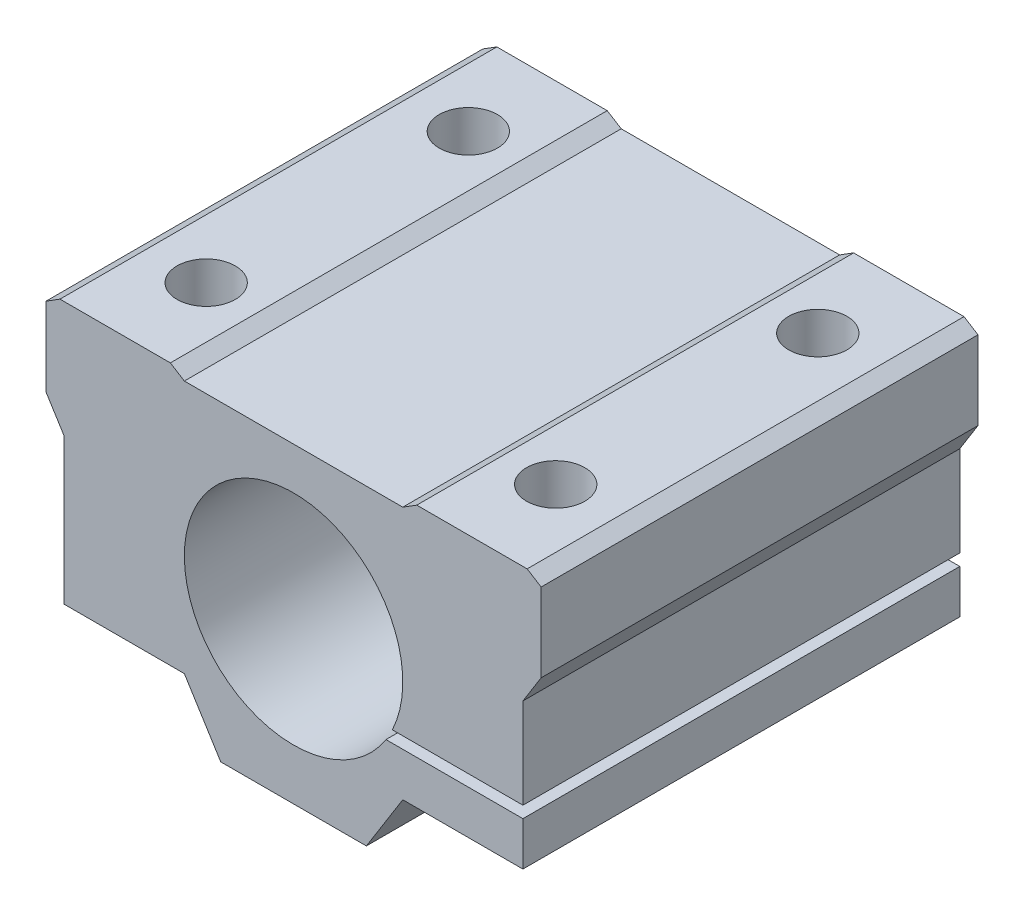
ISO-10303-21;
HEADER;
FILE_DESCRIPTION(('STEP AP214'),'2;1');
FILE_NAME('part.step','',(''),(''),'','','');
FILE_SCHEMA(('AUTOMOTIVE_DESIGN { 1 0 10303 214 1 1 1 1 }'));
ENDSEC;
DATA;
#1=APPLICATION_CONTEXT('core data for automotive mechanical design processes');
#2=APPLICATION_PROTOCOL_DEFINITION('international standard','automotive_design',2000,#1);
#3=PRODUCT_CONTEXT('',#1,'mechanical');
#4=PRODUCT('Part','Part','',(#3));
#5=PRODUCT_RELATED_PRODUCT_CATEGORY('part','',(#4));
#6=PRODUCT_DEFINITION_FORMATION('','',#4);
#7=PRODUCT_DEFINITION_CONTEXT('part definition',#1,'design');
#8=PRODUCT_DEFINITION('design','',#6,#7);
#9=PRODUCT_DEFINITION_SHAPE('','',#8);
#10=(LENGTH_UNIT() NAMED_UNIT(*) SI_UNIT(.MILLI.,.METRE.));
#11=(NAMED_UNIT(*) PLANE_ANGLE_UNIT() SI_UNIT($,.RADIAN.));
#12=(NAMED_UNIT(*) SI_UNIT($,.STERADIAN.) SOLID_ANGLE_UNIT());
#13=UNCERTAINTY_MEASURE_WITH_UNIT(LENGTH_MEASURE(1.E-05),#10,'distance_accuracy_value','');
#14=(GEOMETRIC_REPRESENTATION_CONTEXT(3) GLOBAL_UNCERTAINTY_ASSIGNED_CONTEXT((#13)) GLOBAL_UNIT_ASSIGNED_CONTEXT((#10,
#11,#12)) REPRESENTATION_CONTEXT('',''));
#15=CARTESIAN_POINT('',(0.,0.,0.));
#16=DIRECTION('',(0.,0.,1.));
#17=DIRECTION('',(1.,0.,0.));
#18=AXIS2_PLACEMENT_3D('',#15,#16,#17);
#19=CARTESIAN_POINT('',(-12.,-11.,24.));
#20=DIRECTION('',(0.,1.,0.));
#21=DIRECTION('',(-1.,0.,0.));
#22=AXIS2_PLACEMENT_3D('',#19,#20,#21);
#23=CYLINDRICAL_SURFACE('',#22,1.7);
#24=CARTESIAN_POINT('',(-12.,-7.,24.));
#25=DIRECTION('',(0.,1.,0.));
#26=DIRECTION('',(-1.,0.,0.));
#27=AXIS2_PLACEMENT_3D('',#24,#25,#26);
#28=CIRCLE('',#27,1.7);
#29=CARTESIAN_POINT('',(-13.7,-7.00000000000001,24.));
#30=VERTEX_POINT('',#29);
#31=EDGE_CURVE('E346',#30,#30,#28,.T.);
#32=ORIENTED_EDGE('',*,*,#31,.F.);
#33=EDGE_LOOP('',(#32));
#34=FACE_BOUND('',#33,.T.);
#35=CARTESIAN_POINT('',(-12.,3.,24.));
#36=DIRECTION('',(0.,1.,0.));
#37=DIRECTION('',(-1.,0.,0.));
#38=AXIS2_PLACEMENT_3D('',#35,#36,#37);
#39=CIRCLE('',#38,1.7);
#40=CARTESIAN_POINT('',(-13.7,3.,24.));
#41=VERTEX_POINT('',#40);
#42=EDGE_CURVE('E362',#41,#41,#39,.F.);
#43=ORIENTED_EDGE('',*,*,#42,.F.);
#44=EDGE_LOOP('',(#43));
#45=FACE_BOUND('',#44,.T.);
#46=ADVANCED_FACE('F33',(#34,#45),#23,.F.);
#47=CARTESIAN_POINT('',(12.,-11.,6.));
#48=DIRECTION('',(0.,1.,0.));
#49=DIRECTION('',(-1.,0.,0.));
#50=AXIS2_PLACEMENT_3D('',#47,#48,#49);
#51=CYLINDRICAL_SURFACE('',#50,1.7);
#52=CARTESIAN_POINT('',(12.,-3.2,6.));
#53=DIRECTION('',(0.,1.,0.));
#54=DIRECTION('',(-1.,0.,0.));
#55=AXIS2_PLACEMENT_3D('',#52,#53,#54);
#56=CIRCLE('',#55,1.7);
#57=CARTESIAN_POINT('',(10.3,-3.2,6.));
#58=VERTEX_POINT('',#57);
#59=EDGE_CURVE('E342',#58,#58,#56,.T.);
#60=ORIENTED_EDGE('',*,*,#59,.F.);
#61=EDGE_LOOP('',(#60));
#62=FACE_BOUND('',#61,.T.);
#63=CARTESIAN_POINT('',(12.,3.,6.));
#64=DIRECTION('',(0.,1.,0.));
#65=DIRECTION('',(-1.,0.,0.));
#66=AXIS2_PLACEMENT_3D('',#63,#64,#65);
#67=CIRCLE('',#66,1.7);
#68=CARTESIAN_POINT('',(10.3,3.,6.));
#69=VERTEX_POINT('',#68);
#70=EDGE_CURVE('E354',#69,#69,#67,.F.);
#71=ORIENTED_EDGE('',*,*,#70,.F.);
#72=EDGE_LOOP('',(#71));
#73=FACE_BOUND('',#72,.T.);
#74=ADVANCED_FACE('F513',(#62,#73),#51,.F.);
#75=CARTESIAN_POINT('',(15.75,-7.,30.));
#76=DIRECTION('',(-1.,0.,0.));
#77=DIRECTION('',(0.,0.,1.));
#78=AXIS2_PLACEMENT_3D('',#75,#76,#77);
#79=PLANE('',#78);
#80=DIRECTION('',(0.,1.,0.));
#81=VECTOR('',#80,1.);
#82=CARTESIAN_POINT('',(15.75,-7.,0.));
#83=LINE('',#82,#81);
#84=CARTESIAN_POINT('',(15.75,-7.,0.));
#85=VERTEX_POINT('',#84);
#86=CARTESIAN_POINT('',(15.75,-4.,0.));
#87=VERTEX_POINT('',#86);
#88=EDGE_CURVE('E250',#85,#87,#83,.T.);
#89=ORIENTED_EDGE('',*,*,#88,.T.);
#90=DIRECTION('',(0.,0.,1.));
#91=VECTOR('',#90,1.);
#92=CARTESIAN_POINT('',(15.75,-4.,30.));
#93=LINE('',#92,#91);
#94=CARTESIAN_POINT('',(15.75,-4.,30.));
#95=VERTEX_POINT('',#94);
#96=EDGE_CURVE('E188',#87,#95,#93,.T.);
#97=ORIENTED_EDGE('',*,*,#96,.T.);
#98=DIRECTION('',(0.,1.,0.));
#99=VECTOR('',#98,1.);
#100=CARTESIAN_POINT('',(15.75,-7.,30.));
#101=LINE('',#100,#99);
#102=CARTESIAN_POINT('',(15.75,-7.,30.));
#103=VERTEX_POINT('',#102);
#104=EDGE_CURVE('E205',#103,#95,#101,.T.);
#105=ORIENTED_EDGE('',*,*,#104,.F.);
#106=DIRECTION('',(0.,0.,-1.));
#107=VECTOR('',#106,1.);
#108=CARTESIAN_POINT('',(15.75,-7.,30.));
#109=LINE('',#108,#107);
#110=EDGE_CURVE('E328',#103,#85,#109,.T.);
#111=ORIENTED_EDGE('',*,*,#110,.T.);
#112=EDGE_LOOP('',(#89,#97,#105,#111));
#113=FACE_BOUND('',#112,.T.);
#114=ADVANCED_FACE('F424',(#113),#79,.F.);
#115=CARTESIAN_POINT('',(0.,0.,30.));
#116=DIRECTION('',(0.,0.,1.));
#117=DIRECTION('',(1.,0.,0.));
#118=AXIS2_PLACEMENT_3D('',#115,#116,#117);
#119=PLANE('',#118);
#120=DIRECTION('',(1.,0.,0.));
#121=VECTOR('',#120,1.);
#122=CARTESIAN_POINT('',(17.,-4.,30.));
#123=LINE('',#122,#121);
#124=CARTESIAN_POINT('',(6.34428877022476,-4.,30.));
#125=VERTEX_POINT('',#124);
#126=EDGE_CURVE('E198',#125,#95,#123,.T.);
#127=ORIENTED_EDGE('',*,*,#126,.F.);
#128=CARTESIAN_POINT('',(0.,0.,30.));
#129=DIRECTION('',(0.,0.,1.));
#130=DIRECTION('',(1.,0.,0.));
#131=AXIS2_PLACEMENT_3D('',#128,#129,#130);
#132=CIRCLE('',#131,7.5);
#133=CARTESIAN_POINT('',(6.78306715284465,-3.2,30.));
#134=VERTEX_POINT('',#133);
#135=EDGE_CURVE('E197',#134,#125,#132,.T.);
#136=ORIENTED_EDGE('',*,*,#135,.F.);
#137=DIRECTION('',(-1.,0.,0.));
#138=VECTOR('',#137,1.);
#139=CARTESIAN_POINT('',(17.,-3.2,30.));
#140=LINE('',#139,#138);
#141=CARTESIAN_POINT('',(15.75,-3.2,30.));
#142=VERTEX_POINT('',#141);
#143=EDGE_CURVE('E57',#142,#134,#140,.T.);
#144=ORIENTED_EDGE('',*,*,#143,.F.);
#145=CARTESIAN_POINT('',(15.75,3.,30.));
#146=VERTEX_POINT('',#145);
#147=EDGE_CURVE('E194',#142,#146,#101,.T.);
#148=ORIENTED_EDGE('',*,*,#147,.T.);
#149=DIRECTION('',(0.529998940003179,0.847998304005088,0.));
#150=VECTOR('',#149,1.);
#151=CARTESIAN_POINT('',(15.75,3.,30.));
#152=LINE('',#151,#150);
#153=CARTESIAN_POINT('',(17.,5.,30.));
#154=VERTEX_POINT('',#153);
#155=EDGE_CURVE('E209',#146,#154,#152,.T.);
#156=ORIENTED_EDGE('',*,*,#155,.T.);
#157=DIRECTION('',(0.,1.,0.));
#158=VECTOR('',#157,1.);
#159=CARTESIAN_POINT('',(17.,5.,30.));
#160=LINE('',#159,#158);
#161=CARTESIAN_POINT('',(17.,10.4,30.));
#162=VERTEX_POINT('',#161);
#163=EDGE_CURVE('E215',#154,#162,#160,.T.);
#164=ORIENTED_EDGE('',*,*,#163,.T.);
#165=DIRECTION('',(-0.847998304005089,0.529998940003177,0.));
#166=VECTOR('',#165,1.);
#167=CARTESIAN_POINT('',(17.,10.4,30.));
#168=LINE('',#167,#166);
#169=CARTESIAN_POINT('',(16.04,11.,30.));
#170=VERTEX_POINT('',#169);
#171=EDGE_CURVE('E217',#162,#170,#168,.T.);
#172=ORIENTED_EDGE('',*,*,#171,.T.);
#173=DIRECTION('',(-1.,0.,0.));
#174=VECTOR('',#173,1.);
#175=CARTESIAN_POINT('',(16.04,11.,30.));
#176=LINE('',#175,#174);
#177=CARTESIAN_POINT('',(8.46000000000001,11.,30.));
#178=VERTEX_POINT('',#177);
#179=EDGE_CURVE('E219',#170,#178,#176,.T.);
#180=ORIENTED_EDGE('',*,*,#179,.T.);
#181=DIRECTION('',(-0.847998304005089,-0.529998940003177,0.));
#182=VECTOR('',#181,1.);
#183=CARTESIAN_POINT('',(8.46000000000001,11.,30.));
#184=LINE('',#183,#182);
#185=CARTESIAN_POINT('',(7.5,10.4,30.));
#186=VERTEX_POINT('',#185);
#187=EDGE_CURVE('E221',#178,#186,#184,.T.);
#188=ORIENTED_EDGE('',*,*,#187,.T.);
#189=DIRECTION('',(-1.,0.,0.));
#190=VECTOR('',#189,1.);
#191=CARTESIAN_POINT('',(7.5,10.4,30.));
#192=LINE('',#191,#190);
#193=CARTESIAN_POINT('',(-7.5,10.4,30.));
#194=VERTEX_POINT('',#193);
#195=EDGE_CURVE('E223',#186,#194,#192,.T.);
#196=ORIENTED_EDGE('',*,*,#195,.T.);
#197=DIRECTION('',(-0.847998304005089,0.529998940003177,0.));
#198=VECTOR('',#197,1.);
#199=CARTESIAN_POINT('',(-8.46000000000001,11.,30.));
#200=LINE('',#199,#198);
#201=CARTESIAN_POINT('',(-8.46000000000001,11.,30.));
#202=VERTEX_POINT('',#201);
#203=EDGE_CURVE('E225',#194,#202,#200,.T.);
#204=ORIENTED_EDGE('',*,*,#203,.T.);
#205=DIRECTION('',(-1.,0.,0.));
#206=VECTOR('',#205,1.);
#207=CARTESIAN_POINT('',(-16.04,11.,30.));
#208=LINE('',#207,#206);
#209=CARTESIAN_POINT('',(-16.04,11.,30.));
#210=VERTEX_POINT('',#209);
#211=EDGE_CURVE('E227',#202,#210,#208,.T.);
#212=ORIENTED_EDGE('',*,*,#211,.T.);
#213=DIRECTION('',(-0.847998304005089,-0.529998940003177,0.));
#214=VECTOR('',#213,1.);
#215=CARTESIAN_POINT('',(-17.,10.4,30.));
#216=LINE('',#215,#214);
#217=CARTESIAN_POINT('',(-17.,10.4,30.));
#218=VERTEX_POINT('',#217);
#219=EDGE_CURVE('E229',#210,#218,#216,.T.);
#220=ORIENTED_EDGE('',*,*,#219,.T.);
#221=DIRECTION('',(0.,-1.,0.));
#222=VECTOR('',#221,1.);
#223=CARTESIAN_POINT('',(-17.,5.,30.));
#224=LINE('',#223,#222);
#225=CARTESIAN_POINT('',(-17.,5.,30.));
#226=VERTEX_POINT('',#225);
#227=EDGE_CURVE('E231',#218,#226,#224,.T.);
#228=ORIENTED_EDGE('',*,*,#227,.T.);
#229=DIRECTION('',(0.529998940003179,-0.847998304005088,0.));
#230=VECTOR('',#229,1.);
#231=CARTESIAN_POINT('',(-15.75,3.,30.));
#232=LINE('',#231,#230);
#233=CARTESIAN_POINT('',(-15.75,3.,30.));
#234=VERTEX_POINT('',#233);
#235=EDGE_CURVE('E233',#226,#234,#232,.T.);
#236=ORIENTED_EDGE('',*,*,#235,.T.);
#237=DIRECTION('',(0.,-1.,0.));
#238=VECTOR('',#237,1.);
#239=CARTESIAN_POINT('',(-15.75,-7.00000000000001,30.));
#240=LINE('',#239,#238);
#241=CARTESIAN_POINT('',(-15.75,-7.00000000000001,30.));
#242=VERTEX_POINT('',#241);
#243=EDGE_CURVE('E235',#234,#242,#240,.T.);
#244=ORIENTED_EDGE('',*,*,#243,.T.);
#245=DIRECTION('',(1.,0.,0.));
#246=VECTOR('',#245,1.);
#247=CARTESIAN_POINT('',(-7.5,-7.,30.));
#248=LINE('',#247,#246);
#249=CARTESIAN_POINT('',(-7.5,-7.,30.));
#250=VERTEX_POINT('',#249);
#251=EDGE_CURVE('E237',#242,#250,#248,.T.);
#252=ORIENTED_EDGE('',*,*,#251,.T.);
#253=DIRECTION('',(0.529998940003179,-0.847998304005088,0.));
#254=VECTOR('',#253,1.);
#255=CARTESIAN_POINT('',(-5.,-11.,30.));
#256=LINE('',#255,#254);
#257=CARTESIAN_POINT('',(-5.,-11.,30.));
#258=VERTEX_POINT('',#257);
#259=EDGE_CURVE('E239',#250,#258,#256,.T.);
#260=ORIENTED_EDGE('',*,*,#259,.T.);
#261=DIRECTION('',(1.,0.,0.));
#262=VECTOR('',#261,1.);
#263=CARTESIAN_POINT('',(-5.,-11.,30.));
#264=LINE('',#263,#262);
#265=CARTESIAN_POINT('',(5.00000000000001,-11.,30.));
#266=VERTEX_POINT('',#265);
#267=EDGE_CURVE('E241',#258,#266,#264,.T.);
#268=ORIENTED_EDGE('',*,*,#267,.T.);
#269=DIRECTION('',(0.529998940003179,0.847998304005089,0.));
#270=VECTOR('',#269,1.);
#271=CARTESIAN_POINT('',(5.00000000000001,-11.,30.));
#272=LINE('',#271,#270);
#273=CARTESIAN_POINT('',(7.5,-7.,30.));
#274=VERTEX_POINT('',#273);
#275=EDGE_CURVE('E210',#266,#274,#272,.T.);
#276=ORIENTED_EDGE('',*,*,#275,.T.);
#277=DIRECTION('',(1.,0.,0.));
#278=VECTOR('',#277,1.);
#279=CARTESIAN_POINT('',(7.5,-7.,30.));
#280=LINE('',#279,#278);
#281=EDGE_CURVE('E206',#274,#103,#280,.T.);
#282=ORIENTED_EDGE('',*,*,#281,.T.);
#283=ORIENTED_EDGE('',*,*,#104,.T.);
#284=EDGE_LOOP('',(#127,#136,#144,#148,#156,#164,#172,#180,#188,#196,#204,#212,#220,#228,#236,
#244,#252,#260,#268,#276,#282,#283));
#285=FACE_BOUND('',#284,.T.);
#286=ADVANCED_FACE('F193',(#285),#119,.T.);
#287=CARTESIAN_POINT('',(0.,0.,0.));
#288=DIRECTION('',(0.,0.,1.));
#289=DIRECTION('',(1.,0.,0.));
#290=AXIS2_PLACEMENT_3D('',#287,#288,#289);
#291=PLANE('',#290);
#292=CARTESIAN_POINT('',(0.,0.,0.));
#293=DIRECTION('',(0.,0.,1.));
#294=DIRECTION('',(1.,0.,0.));
#295=AXIS2_PLACEMENT_3D('',#292,#293,#294);
#296=CIRCLE('',#295,7.5);
#297=CARTESIAN_POINT('',(6.78306715284465,-3.2,0.));
#298=VERTEX_POINT('',#297);
#299=CARTESIAN_POINT('',(6.34428877022476,-4.,0.));
#300=VERTEX_POINT('',#299);
#301=EDGE_CURVE('E408',#298,#300,#296,.T.);
#302=ORIENTED_EDGE('',*,*,#301,.T.);
#303=DIRECTION('',(1.,0.,0.));
#304=VECTOR('',#303,1.);
#305=CARTESIAN_POINT('',(17.,-4.,0.));
#306=LINE('',#305,#304);
#307=EDGE_CURVE('E49',#300,#87,#306,.T.);
#308=ORIENTED_EDGE('',*,*,#307,.T.);
#309=ORIENTED_EDGE('',*,*,#88,.F.);
#310=DIRECTION('',(1.,0.,0.));
#311=VECTOR('',#310,1.);
#312=CARTESIAN_POINT('',(7.5,-7.,0.));
#313=LINE('',#312,#311);
#314=CARTESIAN_POINT('',(7.5,-7.,0.));
#315=VERTEX_POINT('',#314);
#316=EDGE_CURVE('E247',#315,#85,#313,.T.);
#317=ORIENTED_EDGE('',*,*,#316,.F.);
#318=DIRECTION('',(0.529998940003179,0.847998304005089,0.));
#319=VECTOR('',#318,1.);
#320=CARTESIAN_POINT('',(5.00000000000001,-11.,0.));
#321=LINE('',#320,#319);
#322=CARTESIAN_POINT('',(5.00000000000001,-11.,0.));
#323=VERTEX_POINT('',#322);
#324=EDGE_CURVE('E244',#323,#315,#321,.T.);
#325=ORIENTED_EDGE('',*,*,#324,.F.);
#326=DIRECTION('',(1.,0.,0.));
#327=VECTOR('',#326,1.);
#328=CARTESIAN_POINT('',(-5.,-11.,0.));
#329=LINE('',#328,#327);
#330=CARTESIAN_POINT('',(-5.,-11.,0.));
#331=VERTEX_POINT('',#330);
#332=EDGE_CURVE('E281',#331,#323,#329,.T.);
#333=ORIENTED_EDGE('',*,*,#332,.F.);
#334=DIRECTION('',(0.529998940003179,-0.847998304005088,0.));
#335=VECTOR('',#334,1.);
#336=CARTESIAN_POINT('',(-5.,-11.,0.));
#337=LINE('',#336,#335);
#338=CARTESIAN_POINT('',(-7.5,-7.,0.));
#339=VERTEX_POINT('',#338);
#340=EDGE_CURVE('E279',#339,#331,#337,.T.);
#341=ORIENTED_EDGE('',*,*,#340,.F.);
#342=DIRECTION('',(1.,0.,0.));
#343=VECTOR('',#342,1.);
#344=CARTESIAN_POINT('',(-7.5,-7.,0.));
#345=LINE('',#344,#343);
#346=CARTESIAN_POINT('',(-15.75,-7.00000000000001,0.));
#347=VERTEX_POINT('',#346);
#348=EDGE_CURVE('E277',#347,#339,#345,.T.);
#349=ORIENTED_EDGE('',*,*,#348,.F.);
#350=DIRECTION('',(0.,-1.,0.));
#351=VECTOR('',#350,1.);
#352=CARTESIAN_POINT('',(-15.75,-7.00000000000001,0.));
#353=LINE('',#352,#351);
#354=CARTESIAN_POINT('',(-15.75,3.,0.));
#355=VERTEX_POINT('',#354);
#356=EDGE_CURVE('E275',#355,#347,#353,.T.);
#357=ORIENTED_EDGE('',*,*,#356,.F.);
#358=DIRECTION('',(0.529998940003179,-0.847998304005088,0.));
#359=VECTOR('',#358,1.);
#360=CARTESIAN_POINT('',(-15.75,3.,0.));
#361=LINE('',#360,#359);
#362=CARTESIAN_POINT('',(-17.,5.,0.));
#363=VERTEX_POINT('',#362);
#364=EDGE_CURVE('E273',#363,#355,#361,.T.);
#365=ORIENTED_EDGE('',*,*,#364,.F.);
#366=DIRECTION('',(0.,-1.,0.));
#367=VECTOR('',#366,1.);
#368=CARTESIAN_POINT('',(-17.,5.,0.));
#369=LINE('',#368,#367);
#370=CARTESIAN_POINT('',(-17.,10.4,0.));
#371=VERTEX_POINT('',#370);
#372=EDGE_CURVE('E271',#371,#363,#369,.T.);
#373=ORIENTED_EDGE('',*,*,#372,.F.);
#374=DIRECTION('',(-0.847998304005089,-0.529998940003177,0.));
#375=VECTOR('',#374,1.);
#376=CARTESIAN_POINT('',(-17.,10.4,0.));
#377=LINE('',#376,#375);
#378=CARTESIAN_POINT('',(-16.04,11.,0.));
#379=VERTEX_POINT('',#378);
#380=EDGE_CURVE('E269',#379,#371,#377,.T.);
#381=ORIENTED_EDGE('',*,*,#380,.F.);
#382=DIRECTION('',(-1.,0.,0.));
#383=VECTOR('',#382,1.);
#384=CARTESIAN_POINT('',(-16.04,11.,0.));
#385=LINE('',#384,#383);
#386=CARTESIAN_POINT('',(-8.46000000000001,11.,0.));
#387=VERTEX_POINT('',#386);
#388=EDGE_CURVE('E267',#387,#379,#385,.T.);
#389=ORIENTED_EDGE('',*,*,#388,.F.);
#390=DIRECTION('',(-0.847998304005089,0.529998940003177,0.));
#391=VECTOR('',#390,1.);
#392=CARTESIAN_POINT('',(-8.46000000000001,11.,0.));
#393=LINE('',#392,#391);
#394=CARTESIAN_POINT('',(-7.5,10.4,0.));
#395=VERTEX_POINT('',#394);
#396=EDGE_CURVE('E265',#395,#387,#393,.T.);
#397=ORIENTED_EDGE('',*,*,#396,.F.);
#398=DIRECTION('',(-1.,0.,0.));
#399=VECTOR('',#398,1.);
#400=CARTESIAN_POINT('',(7.5,10.4,0.));
#401=LINE('',#400,#399);
#402=CARTESIAN_POINT('',(7.5,10.4,0.));
#403=VERTEX_POINT('',#402);
#404=EDGE_CURVE('E263',#403,#395,#401,.T.);
#405=ORIENTED_EDGE('',*,*,#404,.F.);
#406=DIRECTION('',(-0.847998304005089,-0.529998940003177,0.));
#407=VECTOR('',#406,1.);
#408=CARTESIAN_POINT('',(8.46000000000001,11.,0.));
#409=LINE('',#408,#407);
#410=CARTESIAN_POINT('',(8.46000000000001,11.,0.));
#411=VERTEX_POINT('',#410);
#412=EDGE_CURVE('E261',#411,#403,#409,.T.);
#413=ORIENTED_EDGE('',*,*,#412,.F.);
#414=DIRECTION('',(-1.,0.,0.));
#415=VECTOR('',#414,1.);
#416=CARTESIAN_POINT('',(16.04,11.,0.));
#417=LINE('',#416,#415);
#418=CARTESIAN_POINT('',(16.04,11.,0.));
#419=VERTEX_POINT('',#418);
#420=EDGE_CURVE('E259',#419,#411,#417,.T.);
#421=ORIENTED_EDGE('',*,*,#420,.F.);
#422=DIRECTION('',(-0.847998304005089,0.529998940003177,0.));
#423=VECTOR('',#422,1.);
#424=CARTESIAN_POINT('',(17.,10.4,0.));
#425=LINE('',#424,#423);
#426=CARTESIAN_POINT('',(17.,10.4,0.));
#427=VERTEX_POINT('',#426);
#428=EDGE_CURVE('E257',#427,#419,#425,.T.);
#429=ORIENTED_EDGE('',*,*,#428,.F.);
#430=DIRECTION('',(0.,1.,0.));
#431=VECTOR('',#430,1.);
#432=CARTESIAN_POINT('',(17.,5.,0.));
#433=LINE('',#432,#431);
#434=CARTESIAN_POINT('',(17.,5.,0.));
#435=VERTEX_POINT('',#434);
#436=EDGE_CURVE('E255',#435,#427,#433,.T.);
#437=ORIENTED_EDGE('',*,*,#436,.F.);
#438=DIRECTION('',(0.529998940003179,0.847998304005088,0.));
#439=VECTOR('',#438,1.);
#440=CARTESIAN_POINT('',(15.75,3.,0.));
#441=LINE('',#440,#439);
#442=CARTESIAN_POINT('',(15.75,3.,0.));
#443=VERTEX_POINT('',#442);
#444=EDGE_CURVE('E253',#443,#435,#441,.T.);
#445=ORIENTED_EDGE('',*,*,#444,.F.);
#446=CARTESIAN_POINT('',(15.75,-3.2,0.));
#447=VERTEX_POINT('',#446);
#448=EDGE_CURVE('E249',#447,#443,#83,.T.);
#449=ORIENTED_EDGE('',*,*,#448,.F.);
#450=DIRECTION('',(-1.,0.,0.));
#451=VECTOR('',#450,1.);
#452=CARTESIAN_POINT('',(17.,-3.2,0.));
#453=LINE('',#452,#451);
#454=EDGE_CURVE('E184',#447,#298,#453,.T.);
#455=ORIENTED_EDGE('',*,*,#454,.T.);
#456=EDGE_LOOP('',(#302,#308,#309,#317,#325,#333,#341,#349,#357,#365,#373,#381,#389,#397,#405,
#413,#421,#429,#437,#445,#449,#455));
#457=FACE_BOUND('',#456,.T.);
#458=ADVANCED_FACE('F429',(#457),#291,.F.);
#459=CARTESIAN_POINT('',(5.00000000000001,-11.,30.));
#460=DIRECTION('',(-0.847998304005088,0.529998940003179,0.));
#461=DIRECTION('',(-0.529998940003179,-0.847998304005089,0.));
#462=AXIS2_PLACEMENT_3D('',#459,#460,#461);
#463=PLANE('',#462);
#464=ORIENTED_EDGE('',*,*,#324,.T.);
#465=DIRECTION('',(0.,0.,-1.));
#466=VECTOR('',#465,1.);
#467=CARTESIAN_POINT('',(7.5,-7.,30.));
#468=LINE('',#467,#466);
#469=EDGE_CURVE('E331',#274,#315,#468,.T.);
#470=ORIENTED_EDGE('',*,*,#469,.F.);
#471=ORIENTED_EDGE('',*,*,#275,.F.);
#472=DIRECTION('',(0.,0.,-1.));
#473=VECTOR('',#472,1.);
#474=CARTESIAN_POINT('',(5.00000000000001,-11.,30.));
#475=LINE('',#474,#473);
#476=EDGE_CURVE('E243',#266,#323,#475,.T.);
#477=ORIENTED_EDGE('',*,*,#476,.T.);
#478=EDGE_LOOP('',(#464,#470,#471,#477));
#479=FACE_BOUND('',#478,.T.);
#480=ADVANCED_FACE('F35',(#479),#463,.F.);
#481=CARTESIAN_POINT('',(7.5,-7.,30.));
#482=DIRECTION('',(0.,1.,0.));
#483=DIRECTION('',(-1.,0.,0.));
#484=AXIS2_PLACEMENT_3D('',#481,#482,#483);
#485=PLANE('',#484);
#486=CARTESIAN_POINT('',(12.,-7.,24.));
#487=DIRECTION('',(0.,1.,0.));
#488=DIRECTION('',(-1.,0.,0.));
#489=AXIS2_PLACEMENT_3D('',#486,#487,#488);
#490=CIRCLE('',#489,1.7);
#491=CARTESIAN_POINT('',(10.3,-7.,24.));
#492=VERTEX_POINT('',#491);
#493=EDGE_CURVE('E349',#492,#492,#490,.T.);
#494=ORIENTED_EDGE('',*,*,#493,.T.);
#495=EDGE_LOOP('',(#494));
#496=FACE_BOUND('',#495,.T.);
#497=CARTESIAN_POINT('',(12.,-7.,6.));
#498=DIRECTION('',(0.,1.,0.));
#499=DIRECTION('',(-1.,0.,0.));
#500=AXIS2_PLACEMENT_3D('',#497,#498,#499);
#501=CIRCLE('',#500,1.7);
#502=CARTESIAN_POINT('',(10.3,-7.,6.));
#503=VERTEX_POINT('',#502);
#504=EDGE_CURVE('E393',#503,#503,#501,.T.);
#505=ORIENTED_EDGE('',*,*,#504,.T.);
#506=EDGE_LOOP('',(#505));
#507=FACE_BOUND('',#506,.T.);
#508=CARTESIAN_POINT('',(11.625,-7.,15.));
#509=DIRECTION('',(0.,-1.,0.));
#510=DIRECTION('',(1.,0.,0.));
#511=AXIS2_PLACEMENT_3D('',#508,#509,#510);
#512=CIRCLE('',#511,1.05);
#513=CARTESIAN_POINT('',(12.675,-7.,15.));
#514=VERTEX_POINT('',#513);
#515=EDGE_CURVE('E396',#514,#514,#512,.T.);
#516=ORIENTED_EDGE('',*,*,#515,.F.);
#517=EDGE_LOOP('',(#516));
#518=FACE_BOUND('',#517,.T.);
#519=ORIENTED_EDGE('',*,*,#316,.T.);
#520=ORIENTED_EDGE('',*,*,#110,.F.);
#521=ORIENTED_EDGE('',*,*,#281,.F.);
#522=ORIENTED_EDGE('',*,*,#469,.T.);
#523=EDGE_LOOP('',(#519,#520,#521,#522));
#524=FACE_BOUND('',#523,.T.);
#525=ADVANCED_FACE('F420',(#496,#507,#518,#524),#485,.F.);
#526=ORIENTED_EDGE('',*,*,#147,.F.);
#527=DIRECTION('',(0.,0.,-1.));
#528=VECTOR('',#527,1.);
#529=CARTESIAN_POINT('',(15.75,-3.2,30.));
#530=LINE('',#529,#528);
#531=EDGE_CURVE('E181',#142,#447,#530,.T.);
#532=ORIENTED_EDGE('',*,*,#531,.T.);
#533=ORIENTED_EDGE('',*,*,#448,.T.);
#534=DIRECTION('',(0.,0.,-1.));
#535=VECTOR('',#534,1.);
#536=CARTESIAN_POINT('',(15.75,3.,30.));
#537=LINE('',#536,#535);
#538=EDGE_CURVE('E203',#146,#443,#537,.T.);
#539=ORIENTED_EDGE('',*,*,#538,.F.);
#540=EDGE_LOOP('',(#526,#532,#533,#539));
#541=FACE_BOUND('',#540,.T.);
#542=ADVANCED_FACE('F201',(#541),#79,.F.);
#543=CARTESIAN_POINT('',(15.75,3.,30.));
#544=DIRECTION('',(-0.847998304005088,0.529998940003179,0.));
#545=DIRECTION('',(-0.529998940003179,-0.847998304005089,0.));
#546=AXIS2_PLACEMENT_3D('',#543,#544,#545);
#547=PLANE('',#546);
#548=ORIENTED_EDGE('',*,*,#444,.T.);
#549=DIRECTION('',(0.,0.,-1.));
#550=VECTOR('',#549,1.);
#551=CARTESIAN_POINT('',(17.,5.,30.));
#552=LINE('',#551,#550);
#553=EDGE_CURVE('E324',#154,#435,#552,.T.);
#554=ORIENTED_EDGE('',*,*,#553,.F.);
#555=ORIENTED_EDGE('',*,*,#155,.F.);
#556=ORIENTED_EDGE('',*,*,#538,.T.);
#557=EDGE_LOOP('',(#548,#554,#555,#556));
#558=FACE_BOUND('',#557,.T.);
#559=ADVANCED_FACE('F433',(#558),#547,.F.);
#560=CARTESIAN_POINT('',(17.,5.,30.));
#561=DIRECTION('',(-1.,0.,0.));
#562=DIRECTION('',(0.,0.,1.));
#563=AXIS2_PLACEMENT_3D('',#560,#561,#562);
#564=PLANE('',#563);
#565=ORIENTED_EDGE('',*,*,#436,.T.);
#566=DIRECTION('',(0.,0.,-1.));
#567=VECTOR('',#566,1.);
#568=CARTESIAN_POINT('',(17.,10.4,30.));
#569=LINE('',#568,#567);
#570=EDGE_CURVE('E321',#162,#427,#569,.T.);
#571=ORIENTED_EDGE('',*,*,#570,.F.);
#572=ORIENTED_EDGE('',*,*,#163,.F.);
#573=ORIENTED_EDGE('',*,*,#553,.T.);
#574=EDGE_LOOP('',(#565,#571,#572,#573));
#575=FACE_BOUND('',#574,.T.);
#576=ADVANCED_FACE('F440',(#575),#564,.F.);
#577=CARTESIAN_POINT('',(17.,10.4,30.));
#578=DIRECTION('',(-0.529998940003177,-0.847998304005089,0.));
#579=DIRECTION('',(0.84799830400509,-0.529998940003178,0.));
#580=AXIS2_PLACEMENT_3D('',#577,#578,#579);
#581=PLANE('',#580);
#582=ORIENTED_EDGE('',*,*,#428,.T.);
#583=DIRECTION('',(0.,0.,-1.));
#584=VECTOR('',#583,1.);
#585=CARTESIAN_POINT('',(16.04,11.,30.));
#586=LINE('',#585,#584);
#587=EDGE_CURVE('E318',#170,#419,#586,.T.);
#588=ORIENTED_EDGE('',*,*,#587,.F.);
#589=ORIENTED_EDGE('',*,*,#171,.F.);
#590=ORIENTED_EDGE('',*,*,#570,.T.);
#591=EDGE_LOOP('',(#582,#588,#589,#590));
#592=FACE_BOUND('',#591,.T.);
#593=ADVANCED_FACE('F443',(#592),#581,.F.);
#594=CARTESIAN_POINT('',(16.04,11.,30.));
#595=DIRECTION('',(0.,-1.,0.));
#596=DIRECTION('',(0.,0.,-1.));
#597=AXIS2_PLACEMENT_3D('',#594,#595,#596);
#598=PLANE('',#597);
#599=CARTESIAN_POINT('',(12.,11.,24.));
#600=DIRECTION('',(0.,1.,0.));
#601=DIRECTION('',(1.,0.,0.));
#602=AXIS2_PLACEMENT_3D('',#599,#600,#601);
#603=CIRCLE('',#602,2.);
#604=CARTESIAN_POINT('',(14.,11.,24.));
#605=VERTEX_POINT('',#604);
#606=EDGE_CURVE('E378',#605,#605,#603,.T.);
#607=ORIENTED_EDGE('',*,*,#606,.F.);
#608=EDGE_LOOP('',(#607));
#609=FACE_BOUND('',#608,.T.);
#610=CARTESIAN_POINT('',(12.,11.,6.));
#611=DIRECTION('',(0.,1.,0.));
#612=DIRECTION('',(-1.,0.,0.));
#613=AXIS2_PLACEMENT_3D('',#610,#611,#612);
#614=CIRCLE('',#613,2.);
#615=CARTESIAN_POINT('',(10.,11.,6.));
#616=VERTEX_POINT('',#615);
#617=EDGE_CURVE('E360',#616,#616,#614,.T.);
#618=ORIENTED_EDGE('',*,*,#617,.F.);
#619=EDGE_LOOP('',(#618));
#620=FACE_BOUND('',#619,.T.);
#621=ORIENTED_EDGE('',*,*,#420,.T.);
#622=DIRECTION('',(0.,0.,-1.));
#623=VECTOR('',#622,1.);
#624=CARTESIAN_POINT('',(8.46000000000001,11.,30.));
#625=LINE('',#624,#623);
#626=EDGE_CURVE('E315',#178,#411,#625,.T.);
#627=ORIENTED_EDGE('',*,*,#626,.F.);
#628=ORIENTED_EDGE('',*,*,#179,.F.);
#629=ORIENTED_EDGE('',*,*,#587,.T.);
#630=EDGE_LOOP('',(#621,#627,#628,#629));
#631=FACE_BOUND('',#630,.T.);
#632=ADVANCED_FACE('F448',(#609,#620,#631),#598,.F.);
#633=CARTESIAN_POINT('',(8.46000000000001,11.,30.));
#634=DIRECTION('',(0.529998940003177,-0.847998304005089,0.));
#635=DIRECTION('',(0.84799830400509,0.529998940003178,0.));
#636=AXIS2_PLACEMENT_3D('',#633,#634,#635);
#637=PLANE('',#636);
#638=ORIENTED_EDGE('',*,*,#412,.T.);
#639=DIRECTION('',(0.,0.,-1.));
#640=VECTOR('',#639,1.);
#641=CARTESIAN_POINT('',(7.5,10.4,30.));
#642=LINE('',#641,#640);
#643=EDGE_CURVE('E312',#186,#403,#642,.T.);
#644=ORIENTED_EDGE('',*,*,#643,.F.);
#645=ORIENTED_EDGE('',*,*,#187,.F.);
#646=ORIENTED_EDGE('',*,*,#626,.T.);
#647=EDGE_LOOP('',(#638,#644,#645,#646));
#648=FACE_BOUND('',#647,.T.);
#649=ADVANCED_FACE('F454',(#648),#637,.F.);
#650=CARTESIAN_POINT('',(7.5,10.4,30.));
#651=DIRECTION('',(0.,-1.,0.));
#652=DIRECTION('',(1.,0.,0.));
#653=AXIS2_PLACEMENT_3D('',#650,#651,#652);
#654=PLANE('',#653);
#655=ORIENTED_EDGE('',*,*,#404,.T.);
#656=DIRECTION('',(0.,0.,-1.));
#657=VECTOR('',#656,1.);
#658=CARTESIAN_POINT('',(-7.5,10.4,30.));
#659=LINE('',#658,#657);
#660=EDGE_CURVE('E309',#194,#395,#659,.T.);
#661=ORIENTED_EDGE('',*,*,#660,.F.);
#662=ORIENTED_EDGE('',*,*,#195,.F.);
#663=ORIENTED_EDGE('',*,*,#643,.T.);
#664=EDGE_LOOP('',(#655,#661,#662,#663));
#665=FACE_BOUND('',#664,.T.);
#666=ADVANCED_FACE('F458',(#665),#654,.F.);
#667=CARTESIAN_POINT('',(-8.46000000000001,11.,30.));
#668=DIRECTION('',(-0.529998940003177,-0.847998304005089,0.));
#669=DIRECTION('',(0.84799830400509,-0.529998940003178,0.));
#670=AXIS2_PLACEMENT_3D('',#667,#668,#669);
#671=PLANE('',#670);
#672=ORIENTED_EDGE('',*,*,#396,.T.);
#673=DIRECTION('',(0.,0.,-1.));
#674=VECTOR('',#673,1.);
#675=CARTESIAN_POINT('',(-8.46000000000001,11.,30.));
#676=LINE('',#675,#674);
#677=EDGE_CURVE('E306',#202,#387,#676,.T.);
#678=ORIENTED_EDGE('',*,*,#677,.F.);
#679=ORIENTED_EDGE('',*,*,#203,.F.);
#680=ORIENTED_EDGE('',*,*,#660,.T.);
#681=EDGE_LOOP('',(#672,#678,#679,#680));
#682=FACE_BOUND('',#681,.T.);
#683=ADVANCED_FACE('F463',(#682),#671,.F.);
#684=CARTESIAN_POINT('',(-16.04,11.,30.));
#685=DIRECTION('',(0.,-1.,0.));
#686=DIRECTION('',(1.,0.,0.));
#687=AXIS2_PLACEMENT_3D('',#684,#685,#686);
#688=PLANE('',#687);
#689=CARTESIAN_POINT('',(-12.,11.,24.));
#690=DIRECTION('',(0.,1.,0.));
#691=DIRECTION('',(-1.,0.,0.));
#692=AXIS2_PLACEMENT_3D('',#689,#690,#691);
#693=CIRCLE('',#692,2.);
#694=CARTESIAN_POINT('',(-14.,11.,24.));
#695=VERTEX_POINT('',#694);
#696=EDGE_CURVE('E371',#695,#695,#693,.T.);
#697=ORIENTED_EDGE('',*,*,#696,.F.);
#698=EDGE_LOOP('',(#697));
#699=FACE_BOUND('',#698,.T.);
#700=CARTESIAN_POINT('',(-12.,11.,6.));
#701=DIRECTION('',(0.,1.,0.));
#702=DIRECTION('',(1.,0.,0.));
#703=AXIS2_PLACEMENT_3D('',#700,#701,#702);
#704=CIRCLE('',#703,2.);
#705=CARTESIAN_POINT('',(-10.,11.,6.));
#706=VERTEX_POINT('',#705);
#707=EDGE_CURVE('E364',#706,#706,#704,.T.);
#708=ORIENTED_EDGE('',*,*,#707,.F.);
#709=EDGE_LOOP('',(#708));
#710=FACE_BOUND('',#709,.T.);
#711=ORIENTED_EDGE('',*,*,#388,.T.);
#712=DIRECTION('',(0.,0.,-1.));
#713=VECTOR('',#712,1.);
#714=CARTESIAN_POINT('',(-16.04,11.,30.));
#715=LINE('',#714,#713);
#716=EDGE_CURVE('E303',#210,#379,#715,.T.);
#717=ORIENTED_EDGE('',*,*,#716,.F.);
#718=ORIENTED_EDGE('',*,*,#211,.F.);
#719=ORIENTED_EDGE('',*,*,#677,.T.);
#720=EDGE_LOOP('',(#711,#717,#718,#719));
#721=FACE_BOUND('',#720,.T.);
#722=ADVANCED_FACE('F469',(#699,#710,#721),#688,.F.);
#723=CARTESIAN_POINT('',(-17.,10.4,30.));
#724=DIRECTION('',(0.529998940003177,-0.847998304005089,0.));
#725=DIRECTION('',(0.84799830400509,0.529998940003178,0.));
#726=AXIS2_PLACEMENT_3D('',#723,#724,#725);
#727=PLANE('',#726);
#728=ORIENTED_EDGE('',*,*,#380,.T.);
#729=DIRECTION('',(0.,0.,-1.));
#730=VECTOR('',#729,1.);
#731=CARTESIAN_POINT('',(-17.,10.4,30.));
#732=LINE('',#731,#730);
#733=EDGE_CURVE('E300',#218,#371,#732,.T.);
#734=ORIENTED_EDGE('',*,*,#733,.F.);
#735=ORIENTED_EDGE('',*,*,#219,.F.);
#736=ORIENTED_EDGE('',*,*,#716,.T.);
#737=EDGE_LOOP('',(#728,#734,#735,#736));
#738=FACE_BOUND('',#737,.T.);
#739=ADVANCED_FACE('F473',(#738),#727,.F.);
#740=CARTESIAN_POINT('',(-17.,5.,30.));
#741=DIRECTION('',(1.,0.,0.));
#742=DIRECTION('',(0.,0.,-1.));
#743=AXIS2_PLACEMENT_3D('',#740,#741,#742);
#744=PLANE('',#743);
#745=ORIENTED_EDGE('',*,*,#372,.T.);
#746=DIRECTION('',(0.,0.,-1.));
#747=VECTOR('',#746,1.);
#748=CARTESIAN_POINT('',(-17.,5.,30.));
#749=LINE('',#748,#747);
#750=EDGE_CURVE('E297',#226,#363,#749,.T.);
#751=ORIENTED_EDGE('',*,*,#750,.F.);
#752=ORIENTED_EDGE('',*,*,#227,.F.);
#753=ORIENTED_EDGE('',*,*,#733,.T.);
#754=EDGE_LOOP('',(#745,#751,#752,#753));
#755=FACE_BOUND('',#754,.T.);
#756=ADVANCED_FACE('F478',(#755),#744,.F.);
#757=CARTESIAN_POINT('',(-15.75,3.,30.));
#758=DIRECTION('',(0.847998304005088,0.529998940003179,0.));
#759=DIRECTION('',(-0.529998940003179,0.847998304005089,0.));
#760=AXIS2_PLACEMENT_3D('',#757,#758,#759);
#761=PLANE('',#760);
#762=ORIENTED_EDGE('',*,*,#364,.T.);
#763=DIRECTION('',(0.,0.,-1.));
#764=VECTOR('',#763,1.);
#765=CARTESIAN_POINT('',(-15.75,3.,30.));
#766=LINE('',#765,#764);
#767=EDGE_CURVE('E294',#234,#355,#766,.T.);
#768=ORIENTED_EDGE('',*,*,#767,.F.);
#769=ORIENTED_EDGE('',*,*,#235,.F.);
#770=ORIENTED_EDGE('',*,*,#750,.T.);
#771=EDGE_LOOP('',(#762,#768,#769,#770));
#772=FACE_BOUND('',#771,.T.);
#773=ADVANCED_FACE('F484',(#772),#761,.F.);
#774=CARTESIAN_POINT('',(-15.75,-7.00000000000001,30.));
#775=DIRECTION('',(1.,0.,0.));
#776=DIRECTION('',(0.,1.,0.));
#777=AXIS2_PLACEMENT_3D('',#774,#775,#776);
#778=PLANE('',#777);
#779=ORIENTED_EDGE('',*,*,#356,.T.);
#780=DIRECTION('',(0.,0.,-1.));
#781=VECTOR('',#780,1.);
#782=CARTESIAN_POINT('',(-15.75,-7.00000000000001,30.));
#783=LINE('',#782,#781);
#784=EDGE_CURVE('E291',#242,#347,#783,.T.);
#785=ORIENTED_EDGE('',*,*,#784,.F.);
#786=ORIENTED_EDGE('',*,*,#243,.F.);
#787=ORIENTED_EDGE('',*,*,#767,.T.);
#788=EDGE_LOOP('',(#779,#785,#786,#787));
#789=FACE_BOUND('',#788,.T.);
#790=ADVANCED_FACE('F488',(#789),#778,.F.);
#791=CARTESIAN_POINT('',(-7.5,-7.,30.));
#792=DIRECTION('',(0.,1.,0.));
#793=DIRECTION('',(-1.,0.,0.));
#794=AXIS2_PLACEMENT_3D('',#791,#792,#793);
#795=PLANE('',#794);
#796=ORIENTED_EDGE('',*,*,#31,.T.);
#797=EDGE_LOOP('',(#796));
#798=FACE_BOUND('',#797,.T.);
#799=CARTESIAN_POINT('',(-12.,-7.,6.));
#800=DIRECTION('',(0.,1.,0.));
#801=DIRECTION('',(-1.,0.,0.));
#802=AXIS2_PLACEMENT_3D('',#799,#800,#801);
#803=CIRCLE('',#802,1.7);
#804=CARTESIAN_POINT('',(-13.7,-7.00000000000001,6.));
#805=VERTEX_POINT('',#804);
#806=EDGE_CURVE('E343',#805,#805,#803,.T.);
#807=ORIENTED_EDGE('',*,*,#806,.T.);
#808=EDGE_LOOP('',(#807));
#809=FACE_BOUND('',#808,.T.);
#810=ORIENTED_EDGE('',*,*,#348,.T.);
#811=DIRECTION('',(0.,0.,-1.));
#812=VECTOR('',#811,1.);
#813=CARTESIAN_POINT('',(-7.5,-7.,30.));
#814=LINE('',#813,#812);
#815=EDGE_CURVE('E288',#250,#339,#814,.T.);
#816=ORIENTED_EDGE('',*,*,#815,.F.);
#817=ORIENTED_EDGE('',*,*,#251,.F.);
#818=ORIENTED_EDGE('',*,*,#784,.T.);
#819=EDGE_LOOP('',(#810,#816,#817,#818));
#820=FACE_BOUND('',#819,.T.);
#821=ADVANCED_FACE('F493',(#798,#809,#820),#795,.F.);
#822=CARTESIAN_POINT('',(-5.,-11.,30.));
#823=DIRECTION('',(0.847998304005088,0.529998940003179,0.));
#824=DIRECTION('',(-0.529998940003179,0.847998304005088,0.));
#825=AXIS2_PLACEMENT_3D('',#822,#823,#824);
#826=PLANE('',#825);
#827=ORIENTED_EDGE('',*,*,#340,.T.);
#828=DIRECTION('',(0.,0.,-1.));
#829=VECTOR('',#828,1.);
#830=CARTESIAN_POINT('',(-5.,-11.,30.));
#831=LINE('',#830,#829);
#832=EDGE_CURVE('E285',#258,#331,#831,.T.);
#833=ORIENTED_EDGE('',*,*,#832,.F.);
#834=ORIENTED_EDGE('',*,*,#259,.F.);
#835=ORIENTED_EDGE('',*,*,#815,.T.);
#836=EDGE_LOOP('',(#827,#833,#834,#835));
#837=FACE_BOUND('',#836,.T.);
#838=ADVANCED_FACE('F497',(#837),#826,.F.);
#839=CARTESIAN_POINT('',(-5.,-11.,30.));
#840=DIRECTION('',(0.,1.,0.));
#841=DIRECTION('',(0.,0.,1.));
#842=AXIS2_PLACEMENT_3D('',#839,#840,#841);
#843=PLANE('',#842);
#844=ORIENTED_EDGE('',*,*,#332,.T.);
#845=ORIENTED_EDGE('',*,*,#476,.F.);
#846=ORIENTED_EDGE('',*,*,#267,.F.);
#847=ORIENTED_EDGE('',*,*,#832,.T.);
#848=EDGE_LOOP('',(#844,#845,#846,#847));
#849=FACE_BOUND('',#848,.T.);
#850=ADVANCED_FACE('F501',(#849),#843,.F.);
#851=CARTESIAN_POINT('',(0.,0.,30.));
#852=DIRECTION('',(0.,0.,-1.));
#853=DIRECTION('',(-1.,0.,0.));
#854=AXIS2_PLACEMENT_3D('',#851,#852,#853);
#855=CYLINDRICAL_SURFACE('',#854,7.5);
#856=DIRECTION('',(0.,0.,-1.));
#857=VECTOR('',#856,1.);
#858=CARTESIAN_POINT('',(6.34428877022476,-4.,30.));
#859=LINE('',#858,#857);
#860=EDGE_CURVE('E11',#300,#125,#859,.F.);
#861=ORIENTED_EDGE('',*,*,#860,.F.);
#862=ORIENTED_EDGE('',*,*,#301,.F.);
#863=DIRECTION('',(0.,0.,-1.));
#864=VECTOR('',#863,1.);
#865=CARTESIAN_POINT('',(6.78306715284465,-3.2,30.));
#866=LINE('',#865,#864);
#867=EDGE_CURVE('E42',#134,#298,#866,.T.);
#868=ORIENTED_EDGE('',*,*,#867,.F.);
#869=ORIENTED_EDGE('',*,*,#135,.T.);
#870=EDGE_LOOP('',(#861,#862,#868,#869));
#871=FACE_BOUND('',#870,.T.);
#872=ADVANCED_FACE('F426',(#871),#855,.F.);
#873=CARTESIAN_POINT('',(17.,-3.2,0.));
#874=DIRECTION('',(0.,1.,0.));
#875=DIRECTION('',(-1.,0.,0.));
#876=AXIS2_PLACEMENT_3D('',#873,#874,#875);
#877=PLANE('',#876);
#878=CARTESIAN_POINT('',(12.,-3.2,24.));
#879=DIRECTION('',(0.,1.,0.));
#880=DIRECTION('',(-1.,0.,0.));
#881=AXIS2_PLACEMENT_3D('',#878,#879,#880);
#882=CIRCLE('',#881,1.7);
#883=CARTESIAN_POINT('',(10.3,-3.2,24.));
#884=VERTEX_POINT('',#883);
#885=EDGE_CURVE('E353',#884,#884,#882,.T.);
#886=ORIENTED_EDGE('',*,*,#885,.T.);
#887=EDGE_LOOP('',(#886));
#888=FACE_BOUND('',#887,.T.);
#889=ORIENTED_EDGE('',*,*,#59,.T.);
#890=EDGE_LOOP('',(#889));
#891=FACE_BOUND('',#890,.T.);
#892=CARTESIAN_POINT('',(11.625,-3.2,15.));
#893=DIRECTION('',(0.,1.,0.));
#894=DIRECTION('',(-1.,0.,0.));
#895=AXIS2_PLACEMENT_3D('',#892,#893,#894);
#896=CIRCLE('',#895,1.05);
#897=CARTESIAN_POINT('',(10.575,-3.2,15.));
#898=VERTEX_POINT('',#897);
#899=EDGE_CURVE('E199',#898,#898,#896,.T.);
#900=ORIENTED_EDGE('',*,*,#899,.T.);
#901=EDGE_LOOP('',(#900));
#902=FACE_BOUND('',#901,.T.);
#903=ORIENTED_EDGE('',*,*,#143,.T.);
#904=ORIENTED_EDGE('',*,*,#867,.T.);
#905=ORIENTED_EDGE('',*,*,#454,.F.);
#906=ORIENTED_EDGE('',*,*,#531,.F.);
#907=EDGE_LOOP('',(#903,#904,#905,#906));
#908=FACE_BOUND('',#907,.T.);
#909=ADVANCED_FACE('F182',(#888,#891,#902,#908),#877,.F.);
#910=CARTESIAN_POINT('',(17.,-4.,0.));
#911=DIRECTION('',(0.,-1.,0.));
#912=DIRECTION('',(1.,0.,0.));
#913=AXIS2_PLACEMENT_3D('',#910,#911,#912);
#914=PLANE('',#913);
#915=CARTESIAN_POINT('',(12.,-4.,24.));
#916=DIRECTION('',(0.,-1.,0.));
#917=DIRECTION('',(1.,0.,0.));
#918=AXIS2_PLACEMENT_3D('',#915,#916,#917);
#919=CIRCLE('',#918,1.7);
#920=CARTESIAN_POINT('',(13.7,-4.,24.));
#921=VERTEX_POINT('',#920);
#922=EDGE_CURVE('E350',#921,#921,#919,.T.);
#923=ORIENTED_EDGE('',*,*,#922,.T.);
#924=EDGE_LOOP('',(#923));
#925=FACE_BOUND('',#924,.T.);
#926=CARTESIAN_POINT('',(12.,-4.,6.));
#927=DIRECTION('',(0.,-1.,0.));
#928=DIRECTION('',(1.,0.,0.));
#929=AXIS2_PLACEMENT_3D('',#926,#927,#928);
#930=CIRCLE('',#929,1.7);
#931=CARTESIAN_POINT('',(13.7,-4.,6.));
#932=VERTEX_POINT('',#931);
#933=EDGE_CURVE('E339',#932,#932,#930,.T.);
#934=ORIENTED_EDGE('',*,*,#933,.T.);
#935=EDGE_LOOP('',(#934));
#936=FACE_BOUND('',#935,.T.);
#937=CARTESIAN_POINT('',(11.625,-4.,15.));
#938=DIRECTION('',(0.,-1.,0.));
#939=DIRECTION('',(1.,0.,0.));
#940=AXIS2_PLACEMENT_3D('',#937,#938,#939);
#941=CIRCLE('',#940,1.05);
#942=CARTESIAN_POINT('',(12.675,-4.,15.));
#943=VERTEX_POINT('',#942);
#944=EDGE_CURVE('E335',#943,#943,#941,.T.);
#945=ORIENTED_EDGE('',*,*,#944,.T.);
#946=EDGE_LOOP('',(#945));
#947=FACE_BOUND('',#946,.T.);
#948=ORIENTED_EDGE('',*,*,#307,.F.);
#949=ORIENTED_EDGE('',*,*,#860,.T.);
#950=ORIENTED_EDGE('',*,*,#126,.T.);
#951=ORIENTED_EDGE('',*,*,#96,.F.);
#952=EDGE_LOOP('',(#948,#949,#950,#951));
#953=FACE_BOUND('',#952,.T.);
#954=ADVANCED_FACE('F544',(#925,#936,#947,#953),#914,.F.);
#955=CARTESIAN_POINT('',(11.625,3.,15.));
#956=DIRECTION('',(0.,-1.,0.));
#957=DIRECTION('',(1.,0.,0.));
#958=AXIS2_PLACEMENT_3D('',#955,#956,#957);
#959=CYLINDRICAL_SURFACE('',#958,1.05);
#960=ORIENTED_EDGE('',*,*,#515,.T.);
#961=EDGE_LOOP('',(#960));
#962=FACE_BOUND('',#961,.T.);
#963=ORIENTED_EDGE('',*,*,#944,.F.);
#964=EDGE_LOOP('',(#963));
#965=FACE_BOUND('',#964,.T.);
#966=ADVANCED_FACE('F542',(#962,#965),#959,.F.);
#967=CARTESIAN_POINT('',(11.625,3.,15.));
#968=DIRECTION('',(0.,-1.,0.));
#969=DIRECTION('',(1.,0.,0.));
#970=AXIS2_PLACEMENT_3D('',#967,#968,#969);
#971=CIRCLE('',#970,1.05);
#972=CARTESIAN_POINT('',(12.675,3.,15.));
#973=VERTEX_POINT('',#972);
#974=EDGE_CURVE('E338',#973,#973,#971,.T.);
#975=ORIENTED_EDGE('',*,*,#974,.F.);
#976=EDGE_LOOP('',(#975));
#977=FACE_BOUND('',#976,.T.);
#978=ORIENTED_EDGE('',*,*,#899,.F.);
#979=EDGE_LOOP('',(#978));
#980=FACE_BOUND('',#979,.T.);
#981=ADVANCED_FACE('F538',(#977,#980),#959,.F.);
#982=CARTESIAN_POINT('',(11.625,3.,15.));
#983=DIRECTION('',(0.,-1.,0.));
#984=DIRECTION('',(1.,0.,0.));
#985=AXIS2_PLACEMENT_3D('',#982,#983,#984);
#986=PLANE('',#985);
#987=ORIENTED_EDGE('',*,*,#974,.T.);
#988=EDGE_LOOP('',(#987));
#989=FACE_BOUND('',#988,.T.);
#990=ADVANCED_FACE('F534',(#989),#986,.T.);
#991=ORIENTED_EDGE('',*,*,#933,.F.);
#992=EDGE_LOOP('',(#991));
#993=FACE_BOUND('',#992,.T.);
#994=ORIENTED_EDGE('',*,*,#504,.F.);
#995=EDGE_LOOP('',(#994));
#996=FACE_BOUND('',#995,.T.);
#997=ADVANCED_FACE('F522',(#993,#996),#51,.F.);
#998=CARTESIAN_POINT('',(-12.,-11.,6.));
#999=DIRECTION('',(0.,1.,0.));
#1000=DIRECTION('',(-1.,0.,0.));
#1001=AXIS2_PLACEMENT_3D('',#998,#999,#1000);
#1002=CYLINDRICAL_SURFACE('',#1001,1.7);
#1003=CARTESIAN_POINT('',(-12.,3.,6.));
#1004=DIRECTION('',(0.,-1.,0.));
#1005=DIRECTION('',(1.,0.,0.));
#1006=AXIS2_PLACEMENT_3D('',#1003,#1004,#1005);
#1007=CIRCLE('',#1006,1.7);
#1008=CARTESIAN_POINT('',(-10.3,3.,6.));
#1009=VERTEX_POINT('',#1008);
#1010=EDGE_CURVE('E358',#1009,#1009,#1007,.F.);
#1011=ORIENTED_EDGE('',*,*,#1010,.T.);
#1012=EDGE_LOOP('',(#1011));
#1013=FACE_BOUND('',#1012,.T.);
#1014=ORIENTED_EDGE('',*,*,#806,.F.);
#1015=EDGE_LOOP('',(#1014));
#1016=FACE_BOUND('',#1015,.T.);
#1017=ADVANCED_FACE('F529',(#1013,#1016),#1002,.F.);
#1018=CARTESIAN_POINT('',(12.,-11.,24.));
#1019=DIRECTION('',(0.,1.,0.));
#1020=DIRECTION('',(-1.,0.,0.));
#1021=AXIS2_PLACEMENT_3D('',#1018,#1019,#1020);
#1022=CYLINDRICAL_SURFACE('',#1021,1.7);
#1023=ORIENTED_EDGE('',*,*,#922,.F.);
#1024=EDGE_LOOP('',(#1023));
#1025=FACE_BOUND('',#1024,.T.);
#1026=ORIENTED_EDGE('',*,*,#493,.F.);
#1027=EDGE_LOOP('',(#1026));
#1028=FACE_BOUND('',#1027,.T.);
#1029=ADVANCED_FACE('F527',(#1025,#1028),#1022,.F.);
#1030=CARTESIAN_POINT('',(12.,3.,24.));
#1031=DIRECTION('',(0.,-1.,0.));
#1032=DIRECTION('',(1.,0.,0.));
#1033=AXIS2_PLACEMENT_3D('',#1030,#1031,#1032);
#1034=CIRCLE('',#1033,1.7);
#1035=CARTESIAN_POINT('',(13.7,3.,24.));
#1036=VERTEX_POINT('',#1035);
#1037=EDGE_CURVE('E37',#1036,#1036,#1034,.F.);
#1038=ORIENTED_EDGE('',*,*,#1037,.T.);
#1039=EDGE_LOOP('',(#1038));
#1040=FACE_BOUND('',#1039,.T.);
#1041=ORIENTED_EDGE('',*,*,#885,.F.);
#1042=EDGE_LOOP('',(#1041));
#1043=FACE_BOUND('',#1042,.T.);
#1044=ADVANCED_FACE('F629',(#1040,#1043),#1022,.F.);
#1045=CARTESIAN_POINT('',(12.,3.,6.));
#1046=DIRECTION('',(0.,1.,0.));
#1047=DIRECTION('',(-1.,0.,0.));
#1048=AXIS2_PLACEMENT_3D('',#1045,#1046,#1047);
#1049=PLANE('',#1048);
#1050=CARTESIAN_POINT('',(12.,3.,6.));
#1051=DIRECTION('',(0.,1.,0.));
#1052=DIRECTION('',(-1.,0.,0.));
#1053=AXIS2_PLACEMENT_3D('',#1050,#1051,#1052);
#1054=CIRCLE('',#1053,2.);
#1055=CARTESIAN_POINT('',(10.,3.,6.));
#1056=VERTEX_POINT('',#1055);
#1057=EDGE_CURVE('E357',#1056,#1056,#1054,.T.);
#1058=ORIENTED_EDGE('',*,*,#1057,.T.);
#1059=EDGE_LOOP('',(#1058));
#1060=FACE_BOUND('',#1059,.T.);
#1061=ORIENTED_EDGE('',*,*,#70,.T.);
#1062=EDGE_LOOP('',(#1061));
#1063=FACE_BOUND('',#1062,.T.);
#1064=ADVANCED_FACE('F663',(#1060,#1063),#1049,.T.);
#1065=CARTESIAN_POINT('',(12.,3.,6.));
#1066=DIRECTION('',(0.,1.,0.));
#1067=DIRECTION('',(-1.,0.,0.));
#1068=AXIS2_PLACEMENT_3D('',#1065,#1066,#1067);
#1069=CYLINDRICAL_SURFACE('',#1068,2.);
#1070=ORIENTED_EDGE('',*,*,#1057,.F.);
#1071=EDGE_LOOP('',(#1070));
#1072=FACE_BOUND('',#1071,.T.);
#1073=ORIENTED_EDGE('',*,*,#617,.T.);
#1074=EDGE_LOOP('',(#1073));
#1075=FACE_BOUND('',#1074,.T.);
#1076=ADVANCED_FACE('F671',(#1072,#1075),#1069,.F.);
#1077=CARTESIAN_POINT('',(-12.,3.,6.));
#1078=DIRECTION('',(0.,-1.,0.));
#1079=DIRECTION('',(1.,0.,0.));
#1080=AXIS2_PLACEMENT_3D('',#1077,#1078,#1079);
#1081=PLANE('',#1080);
#1082=CARTESIAN_POINT('',(-12.,3.,6.));
#1083=DIRECTION('',(0.,1.,0.));
#1084=DIRECTION('',(1.,0.,0.));
#1085=AXIS2_PLACEMENT_3D('',#1082,#1083,#1084);
#1086=CIRCLE('',#1085,2.);
#1087=CARTESIAN_POINT('',(-10.,3.,6.));
#1088=VERTEX_POINT('',#1087);
#1089=EDGE_CURVE('E361',#1088,#1088,#1086,.T.);
#1090=ORIENTED_EDGE('',*,*,#1089,.T.);
#1091=EDGE_LOOP('',(#1090));
#1092=FACE_BOUND('',#1091,.T.);
#1093=ORIENTED_EDGE('',*,*,#1010,.F.);
#1094=EDGE_LOOP('',(#1093));
#1095=FACE_BOUND('',#1094,.T.);
#1096=ADVANCED_FACE('F681',(#1092,#1095),#1081,.F.);
#1097=CARTESIAN_POINT('',(-12.,3.,6.));
#1098=DIRECTION('',(0.,1.,0.));
#1099=DIRECTION('',(-1.,0.,0.));
#1100=AXIS2_PLACEMENT_3D('',#1097,#1098,#1099);
#1101=CYLINDRICAL_SURFACE('',#1100,2.);
#1102=ORIENTED_EDGE('',*,*,#1089,.F.);
#1103=EDGE_LOOP('',(#1102));
#1104=FACE_BOUND('',#1103,.T.);
#1105=ORIENTED_EDGE('',*,*,#707,.T.);
#1106=EDGE_LOOP('',(#1105));
#1107=FACE_BOUND('',#1106,.T.);
#1108=ADVANCED_FACE('F690',(#1104,#1107),#1101,.F.);
#1109=CARTESIAN_POINT('',(-12.,3.,24.));
#1110=DIRECTION('',(0.,1.,0.));
#1111=DIRECTION('',(-1.,0.,0.));
#1112=AXIS2_PLACEMENT_3D('',#1109,#1110,#1111);
#1113=PLANE('',#1112);
#1114=CARTESIAN_POINT('',(-12.,3.,24.));
#1115=DIRECTION('',(0.,1.,0.));
#1116=DIRECTION('',(-1.,0.,0.));
#1117=AXIS2_PLACEMENT_3D('',#1114,#1115,#1116);
#1118=CIRCLE('',#1117,2.);
#1119=CARTESIAN_POINT('',(-14.,3.,24.));
#1120=VERTEX_POINT('',#1119);
#1121=EDGE_CURVE('E365',#1120,#1120,#1118,.T.);
#1122=ORIENTED_EDGE('',*,*,#1121,.T.);
#1123=EDGE_LOOP('',(#1122));
#1124=FACE_BOUND('',#1123,.T.);
#1125=ORIENTED_EDGE('',*,*,#42,.T.);
#1126=EDGE_LOOP('',(#1125));
#1127=FACE_BOUND('',#1126,.T.);
#1128=ADVANCED_FACE('F700',(#1124,#1127),#1113,.T.);
#1129=CARTESIAN_POINT('',(-12.,3.,24.));
#1130=DIRECTION('',(0.,1.,0.));
#1131=DIRECTION('',(-1.,0.,0.));
#1132=AXIS2_PLACEMENT_3D('',#1129,#1130,#1131);
#1133=CYLINDRICAL_SURFACE('',#1132,2.);
#1134=ORIENTED_EDGE('',*,*,#1121,.F.);
#1135=EDGE_LOOP('',(#1134));
#1136=FACE_BOUND('',#1135,.T.);
#1137=ORIENTED_EDGE('',*,*,#696,.T.);
#1138=EDGE_LOOP('',(#1137));
#1139=FACE_BOUND('',#1138,.T.);
#1140=ADVANCED_FACE('F710',(#1136,#1139),#1133,.F.);
#1141=CARTESIAN_POINT('',(12.,3.,24.));
#1142=DIRECTION('',(0.,-1.,0.));
#1143=DIRECTION('',(1.,0.,0.));
#1144=AXIS2_PLACEMENT_3D('',#1141,#1142,#1143);
#1145=PLANE('',#1144);
#1146=CARTESIAN_POINT('',(12.,3.,24.));
#1147=DIRECTION('',(0.,1.,0.));
#1148=DIRECTION('',(1.,0.,0.));
#1149=AXIS2_PLACEMENT_3D('',#1146,#1147,#1148);
#1150=CIRCLE('',#1149,2.);
#1151=CARTESIAN_POINT('',(14.,3.,24.));
#1152=VERTEX_POINT('',#1151);
#1153=EDGE_CURVE('E746',#1152,#1152,#1150,.T.);
#1154=ORIENTED_EDGE('',*,*,#1153,.T.);
#1155=EDGE_LOOP('',(#1154));
#1156=FACE_BOUND('',#1155,.T.);
#1157=ORIENTED_EDGE('',*,*,#1037,.F.);
#1158=EDGE_LOOP('',(#1157));
#1159=FACE_BOUND('',#1158,.T.);
#1160=ADVANCED_FACE('F719',(#1156,#1159),#1145,.F.);
#1161=CARTESIAN_POINT('',(12.,3.,24.));
#1162=DIRECTION('',(0.,1.,0.));
#1163=DIRECTION('',(-1.,0.,0.));
#1164=AXIS2_PLACEMENT_3D('',#1161,#1162,#1163);
#1165=CYLINDRICAL_SURFACE('',#1164,2.);
#1166=ORIENTED_EDGE('',*,*,#1153,.F.);
#1167=EDGE_LOOP('',(#1166));
#1168=FACE_BOUND('',#1167,.T.);
#1169=ORIENTED_EDGE('',*,*,#606,.T.);
#1170=EDGE_LOOP('',(#1169));
#1171=FACE_BOUND('',#1170,.T.);
#1172=ADVANCED_FACE('F729',(#1168,#1171),#1165,.F.);
#1173=CLOSED_SHELL('',(#46,#74,#114,#286,#458,#480,#525,#542,#559,#576,#593,#632,#649,#666,#683,
#722,#739,#756,#773,#790,#821,#838,#850,#872,#909,#954,#966,#981,#990,#997,#1017,#1029,#1044,
#1064,#1076,#1096,#1108,#1128,#1140,#1160,#1172));
#1174=MANIFOLD_SOLID_BREP('B2',#1173);
#1175=ADVANCED_BREP_SHAPE_REPRESENTATION('',(#18,#1174),#14);
#1176=SHAPE_DEFINITION_REPRESENTATION(#9,#1175);
ENDSEC;
END-ISO-10303-21;
